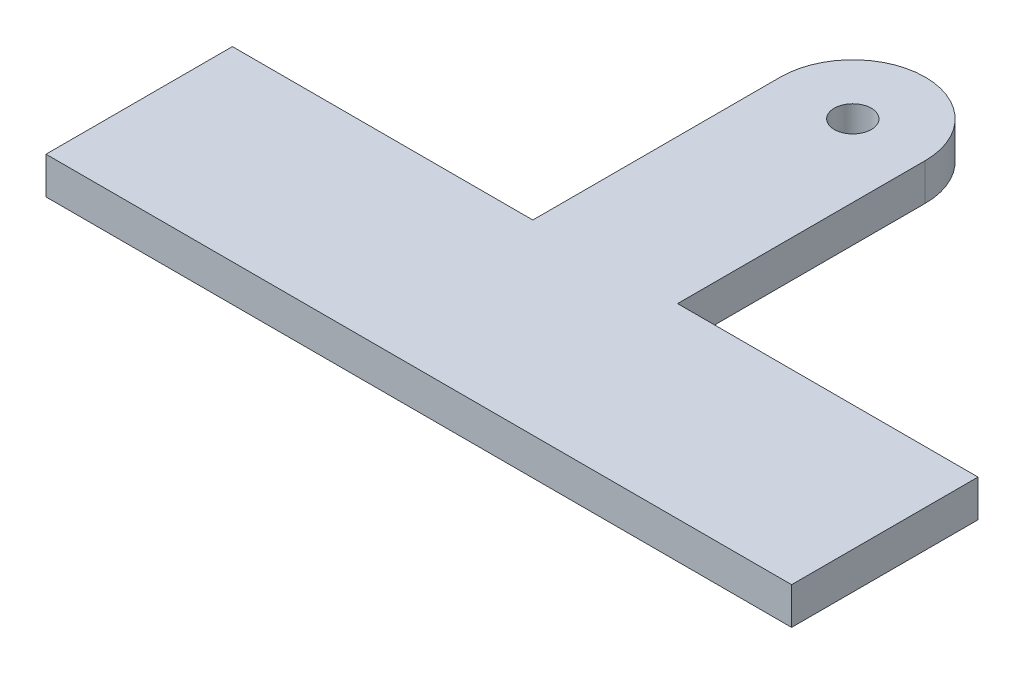
ISO-10303-21;
HEADER;
FILE_DESCRIPTION(('STEP AP214'),'2;1');
FILE_NAME('part.step','',(''),(''),'','','');
FILE_SCHEMA(('AUTOMOTIVE_DESIGN { 1 0 10303 214 1 1 1 1 }'));
ENDSEC;
DATA;
#1=APPLICATION_CONTEXT('core data for automotive mechanical design processes');
#2=APPLICATION_PROTOCOL_DEFINITION('international standard','automotive_design',2000,#1);
#3=PRODUCT_CONTEXT('',#1,'mechanical');
#4=PRODUCT('Part','Part','',(#3));
#5=PRODUCT_RELATED_PRODUCT_CATEGORY('part','',(#4));
#6=PRODUCT_DEFINITION_FORMATION('','',#4);
#7=PRODUCT_DEFINITION_CONTEXT('part definition',#1,'design');
#8=PRODUCT_DEFINITION('design','',#6,#7);
#9=PRODUCT_DEFINITION_SHAPE('','',#8);
#10=(LENGTH_UNIT() NAMED_UNIT(*) SI_UNIT(.MILLI.,.METRE.));
#11=(NAMED_UNIT(*) PLANE_ANGLE_UNIT() SI_UNIT($,.RADIAN.));
#12=(NAMED_UNIT(*) SI_UNIT($,.STERADIAN.) SOLID_ANGLE_UNIT());
#13=UNCERTAINTY_MEASURE_WITH_UNIT(LENGTH_MEASURE(1.E-05),#10,'distance_accuracy_value','');
#14=(GEOMETRIC_REPRESENTATION_CONTEXT(3) GLOBAL_UNCERTAINTY_ASSIGNED_CONTEXT((#13)) GLOBAL_UNIT_ASSIGNED_CONTEXT((#10,
#11,#12)) REPRESENTATION_CONTEXT('',''));
#15=CARTESIAN_POINT('',(0.,0.,0.));
#16=DIRECTION('',(0.,0.,1.));
#17=DIRECTION('',(1.,0.,0.));
#18=AXIS2_PLACEMENT_3D('',#15,#16,#17);
#19=CARTESIAN_POINT('',(0.,1.27,-16.9801410791967));
#20=DIRECTION('',(0.,-1.,0.));
#21=DIRECTION('',(0.,0.,-1.));
#22=AXIS2_PLACEMENT_3D('',#19,#20,#21);
#23=PLANE('',#22);
#24=DIRECTION('',(0.,0.,1.));
#25=VECTOR('',#24,1.);
#26=CARTESIAN_POINT('',(-25.5650668728774,1.27,0.));
#27=LINE('',#26,#25);
#28=CARTESIAN_POINT('',(-25.5650668728774,1.27,0.));
#29=VERTEX_POINT('',#28);
#30=CARTESIAN_POINT('',(-25.5650668728774,1.27,12.7825334364387));
#31=VERTEX_POINT('',#30);
#32=EDGE_CURVE('E145',#29,#31,#27,.T.);
#33=ORIENTED_EDGE('',*,*,#32,.T.);
#34=DIRECTION('',(1.,0.,0.));
#35=VECTOR('',#34,1.);
#36=CARTESIAN_POINT('',(-25.5650668728774,1.27,12.7825334364387));
#37=LINE('',#36,#35);
#38=CARTESIAN_POINT('',(25.5650668728774,1.27,12.7825334364387));
#39=VERTEX_POINT('',#38);
#40=EDGE_CURVE('E93',#31,#39,#37,.T.);
#41=ORIENTED_EDGE('',*,*,#40,.T.);
#42=DIRECTION('',(0.,0.,-1.));
#43=VECTOR('',#42,1.);
#44=CARTESIAN_POINT('',(25.5650668728774,1.27,0.));
#45=LINE('',#44,#43);
#46=CARTESIAN_POINT('',(25.5650668728774,1.27,0.));
#47=VERTEX_POINT('',#46);
#48=EDGE_CURVE('E160',#39,#47,#45,.T.);
#49=ORIENTED_EDGE('',*,*,#48,.T.);
#50=DIRECTION('',(-1.,0.,0.));
#51=VECTOR('',#50,1.);
#52=CARTESIAN_POINT('',(4.96381371332689,1.27,0.));
#53=LINE('',#52,#51);
#54=CARTESIAN_POINT('',(4.96381371332689,1.27,0.));
#55=VERTEX_POINT('',#54);
#56=EDGE_CURVE('E173',#47,#55,#53,.T.);
#57=ORIENTED_EDGE('',*,*,#56,.T.);
#58=DIRECTION('',(0.,0.,-1.));
#59=VECTOR('',#58,1.);
#60=CARTESIAN_POINT('',(4.96381371332689,1.27,0.));
#61=LINE('',#60,#59);
#62=CARTESIAN_POINT('',(4.96381371332689,1.27,-16.9801410791967));
#63=VERTEX_POINT('',#62);
#64=EDGE_CURVE('E112',#55,#63,#61,.T.);
#65=ORIENTED_EDGE('',*,*,#64,.T.);
#66=CARTESIAN_POINT('',(0.,1.27,-16.9801410791967));
#67=DIRECTION('',(0.,1.,0.));
#68=DIRECTION('',(0.,0.,-1.));
#69=AXIS2_PLACEMENT_3D('',#66,#67,#68);
#70=CIRCLE('',#69,4.96381371332689);
#71=CARTESIAN_POINT('',(-4.96381371332689,1.27,-16.9801410791967));
#72=VERTEX_POINT('',#71);
#73=EDGE_CURVE('E106',#63,#72,#70,.T.);
#74=ORIENTED_EDGE('',*,*,#73,.T.);
#75=DIRECTION('',(0.,0.,1.));
#76=VECTOR('',#75,1.);
#77=CARTESIAN_POINT('',(-4.96381371332689,1.27,0.));
#78=LINE('',#77,#76);
#79=CARTESIAN_POINT('',(-4.96381371332689,1.27,0.));
#80=VERTEX_POINT('',#79);
#81=EDGE_CURVE('E110',#72,#80,#78,.T.);
#82=ORIENTED_EDGE('',*,*,#81,.T.);
#83=DIRECTION('',(-1.,0.,0.));
#84=VECTOR('',#83,1.);
#85=CARTESIAN_POINT('',(-25.5650668728774,1.27,0.));
#86=LINE('',#85,#84);
#87=EDGE_CURVE('E50',#80,#29,#86,.T.);
#88=ORIENTED_EDGE('',*,*,#87,.T.);
#89=EDGE_LOOP('',(#33,#41,#49,#57,#65,#74,#82,#88));
#90=FACE_BOUND('',#89,.T.);
#91=CARTESIAN_POINT('',(0.,1.27,-16.9801410791967));
#92=DIRECTION('',(0.,1.,0.));
#93=DIRECTION('',(0.,0.,1.));
#94=AXIS2_PLACEMENT_3D('',#91,#92,#93);
#95=CIRCLE('',#94,1.27);
#96=CARTESIAN_POINT('',(0.,1.27,-15.7101410791967));
#97=VERTEX_POINT('',#96);
#98=EDGE_CURVE('E134',#97,#97,#95,.T.);
#99=ORIENTED_EDGE('',*,*,#98,.F.);
#100=EDGE_LOOP('',(#99));
#101=FACE_BOUND('',#100,.T.);
#102=ADVANCED_FACE('F33',(#90,#101),#23,.F.);
#103=CARTESIAN_POINT('',(0.,-1.27,-16.9801410791967));
#104=DIRECTION('',(0.,-1.,0.));
#105=DIRECTION('',(0.,0.,-1.));
#106=AXIS2_PLACEMENT_3D('',#103,#104,#105);
#107=PLANE('',#106);
#108=DIRECTION('',(0.,0.,1.));
#109=VECTOR('',#108,1.);
#110=CARTESIAN_POINT('',(-25.5650668728774,-1.27,0.));
#111=LINE('',#110,#109);
#112=CARTESIAN_POINT('',(-25.5650668728774,-1.27,0.));
#113=VERTEX_POINT('',#112);
#114=CARTESIAN_POINT('',(-25.5650668728774,-1.27,12.7825334364387));
#115=VERTEX_POINT('',#114);
#116=EDGE_CURVE('E130',#113,#115,#111,.T.);
#117=ORIENTED_EDGE('',*,*,#116,.F.);
#118=DIRECTION('',(-1.,0.,0.));
#119=VECTOR('',#118,1.);
#120=CARTESIAN_POINT('',(-25.5650668728774,-1.27,0.));
#121=LINE('',#120,#119);
#122=CARTESIAN_POINT('',(-4.96381371332689,-1.27,0.));
#123=VERTEX_POINT('',#122);
#124=EDGE_CURVE('E85',#123,#113,#121,.T.);
#125=ORIENTED_EDGE('',*,*,#124,.F.);
#126=DIRECTION('',(0.,0.,1.));
#127=VECTOR('',#126,1.);
#128=CARTESIAN_POINT('',(-4.96381371332689,-1.27,0.));
#129=LINE('',#128,#127);
#130=CARTESIAN_POINT('',(-4.96381371332689,-1.27,-16.9801410791967));
#131=VERTEX_POINT('',#130);
#132=EDGE_CURVE('E79',#131,#123,#129,.T.);
#133=ORIENTED_EDGE('',*,*,#132,.F.);
#134=CARTESIAN_POINT('',(0.,-1.27,-16.9801410791967));
#135=DIRECTION('',(0.,1.,0.));
#136=DIRECTION('',(0.,0.,-1.));
#137=AXIS2_PLACEMENT_3D('',#134,#135,#136);
#138=CIRCLE('',#137,4.96381371332689);
#139=CARTESIAN_POINT('',(4.96381371332689,-1.27,-16.9801410791967));
#140=VERTEX_POINT('',#139);
#141=EDGE_CURVE('E120',#140,#131,#138,.T.);
#142=ORIENTED_EDGE('',*,*,#141,.F.);
#143=DIRECTION('',(0.,0.,-1.));
#144=VECTOR('',#143,1.);
#145=CARTESIAN_POINT('',(4.96381371332689,-1.27,0.));
#146=LINE('',#145,#144);
#147=CARTESIAN_POINT('',(4.96381371332689,-1.27,0.));
#148=VERTEX_POINT('',#147);
#149=EDGE_CURVE('E140',#148,#140,#146,.T.);
#150=ORIENTED_EDGE('',*,*,#149,.F.);
#151=DIRECTION('',(-1.,0.,0.));
#152=VECTOR('',#151,1.);
#153=CARTESIAN_POINT('',(4.96381371332689,-1.27,0.));
#154=LINE('',#153,#152);
#155=CARTESIAN_POINT('',(25.5650668728774,-1.27,0.));
#156=VERTEX_POINT('',#155);
#157=EDGE_CURVE('E138',#156,#148,#154,.T.);
#158=ORIENTED_EDGE('',*,*,#157,.F.);
#159=DIRECTION('',(0.,0.,-1.));
#160=VECTOR('',#159,1.);
#161=CARTESIAN_POINT('',(25.5650668728774,-1.27,0.));
#162=LINE('',#161,#160);
#163=CARTESIAN_POINT('',(25.5650668728774,-1.27,12.7825334364387));
#164=VERTEX_POINT('',#163);
#165=EDGE_CURVE('E136',#164,#156,#162,.T.);
#166=ORIENTED_EDGE('',*,*,#165,.F.);
#167=DIRECTION('',(1.,0.,0.));
#168=VECTOR('',#167,1.);
#169=CARTESIAN_POINT('',(-25.5650668728774,-1.27,12.7825334364387));
#170=LINE('',#169,#168);
#171=EDGE_CURVE('E133',#115,#164,#170,.T.);
#172=ORIENTED_EDGE('',*,*,#171,.F.);
#173=EDGE_LOOP('',(#117,#125,#133,#142,#150,#158,#166,#172));
#174=FACE_BOUND('',#173,.T.);
#175=CARTESIAN_POINT('',(0.,-1.27,-16.9801410791967));
#176=DIRECTION('',(0.,1.,0.));
#177=DIRECTION('',(0.,0.,1.));
#178=AXIS2_PLACEMENT_3D('',#175,#176,#177);
#179=CIRCLE('',#178,1.27);
#180=CARTESIAN_POINT('',(0.,-1.27,-15.7101410791967));
#181=VERTEX_POINT('',#180);
#182=EDGE_CURVE('E179',#181,#181,#179,.T.);
#183=ORIENTED_EDGE('',*,*,#182,.T.);
#184=EDGE_LOOP('',(#183));
#185=FACE_BOUND('',#184,.T.);
#186=ADVANCED_FACE('F164',(#174,#185),#107,.T.);
#187=CARTESIAN_POINT('',(-25.5650668728774,1.27,0.));
#188=DIRECTION('',(1.,0.,0.));
#189=DIRECTION('',(0.,0.,-1.));
#190=AXIS2_PLACEMENT_3D('',#187,#188,#189);
#191=PLANE('',#190);
#192=ORIENTED_EDGE('',*,*,#116,.T.);
#193=DIRECTION('',(0.,-1.,0.));
#194=VECTOR('',#193,1.);
#195=CARTESIAN_POINT('',(-25.5650668728774,1.27,12.7825334364387));
#196=LINE('',#195,#194);
#197=EDGE_CURVE('E11',#31,#115,#196,.T.);
#198=ORIENTED_EDGE('',*,*,#197,.F.);
#199=ORIENTED_EDGE('',*,*,#32,.F.);
#200=DIRECTION('',(0.,-1.,0.));
#201=VECTOR('',#200,1.);
#202=CARTESIAN_POINT('',(-25.5650668728774,1.27,0.));
#203=LINE('',#202,#201);
#204=EDGE_CURVE('E126',#29,#113,#203,.T.);
#205=ORIENTED_EDGE('',*,*,#204,.T.);
#206=EDGE_LOOP('',(#192,#198,#199,#205));
#207=FACE_BOUND('',#206,.T.);
#208=ADVANCED_FACE('F35',(#207),#191,.F.);
#209=CARTESIAN_POINT('',(-25.5650668728774,1.27,12.7825334364387));
#210=DIRECTION('',(0.,0.,-1.));
#211=DIRECTION('',(-1.,0.,0.));
#212=AXIS2_PLACEMENT_3D('',#209,#210,#211);
#213=PLANE('',#212);
#214=ORIENTED_EDGE('',*,*,#171,.T.);
#215=DIRECTION('',(0.,-1.,0.));
#216=VECTOR('',#215,1.);
#217=CARTESIAN_POINT('',(25.5650668728774,1.27,12.7825334364387));
#218=LINE('',#217,#216);
#219=EDGE_CURVE('E42',#39,#164,#218,.T.);
#220=ORIENTED_EDGE('',*,*,#219,.F.);
#221=ORIENTED_EDGE('',*,*,#40,.F.);
#222=ORIENTED_EDGE('',*,*,#197,.T.);
#223=EDGE_LOOP('',(#214,#220,#221,#222));
#224=FACE_BOUND('',#223,.T.);
#225=ADVANCED_FACE('F207',(#224),#213,.F.);
#226=CARTESIAN_POINT('',(25.5650668728774,1.27,0.));
#227=DIRECTION('',(-1.,0.,0.));
#228=DIRECTION('',(0.,0.,1.));
#229=AXIS2_PLACEMENT_3D('',#226,#227,#228);
#230=PLANE('',#229);
#231=ORIENTED_EDGE('',*,*,#165,.T.);
#232=DIRECTION('',(0.,-1.,0.));
#233=VECTOR('',#232,1.);
#234=CARTESIAN_POINT('',(25.5650668728774,1.27,0.));
#235=LINE('',#234,#233);
#236=EDGE_CURVE('E152',#47,#156,#235,.T.);
#237=ORIENTED_EDGE('',*,*,#236,.F.);
#238=ORIENTED_EDGE('',*,*,#48,.F.);
#239=ORIENTED_EDGE('',*,*,#219,.T.);
#240=EDGE_LOOP('',(#231,#237,#238,#239));
#241=FACE_BOUND('',#240,.T.);
#242=ADVANCED_FACE('F158',(#241),#230,.F.);
#243=CARTESIAN_POINT('',(4.96381371332689,1.27,0.));
#244=DIRECTION('',(0.,0.,1.));
#245=DIRECTION('',(1.,0.,0.));
#246=AXIS2_PLACEMENT_3D('',#243,#244,#245);
#247=PLANE('',#246);
#248=ORIENTED_EDGE('',*,*,#157,.T.);
#249=DIRECTION('',(0.,-1.,0.));
#250=VECTOR('',#249,1.);
#251=CARTESIAN_POINT('',(4.96381371332689,1.27,0.));
#252=LINE('',#251,#250);
#253=EDGE_CURVE('E149',#55,#148,#252,.T.);
#254=ORIENTED_EDGE('',*,*,#253,.F.);
#255=ORIENTED_EDGE('',*,*,#56,.F.);
#256=ORIENTED_EDGE('',*,*,#236,.T.);
#257=EDGE_LOOP('',(#248,#254,#255,#256));
#258=FACE_BOUND('',#257,.T.);
#259=ADVANCED_FACE('F169',(#258),#247,.F.);
#260=CARTESIAN_POINT('',(4.96381371332689,1.27,0.));
#261=DIRECTION('',(-1.,0.,0.));
#262=DIRECTION('',(0.,0.,1.));
#263=AXIS2_PLACEMENT_3D('',#260,#261,#262);
#264=PLANE('',#263);
#265=ORIENTED_EDGE('',*,*,#149,.T.);
#266=DIRECTION('',(0.,-1.,0.));
#267=VECTOR('',#266,1.);
#268=CARTESIAN_POINT('',(4.96381371332689,1.27,-16.9801410791967));
#269=LINE('',#268,#267);
#270=EDGE_CURVE('E121',#63,#140,#269,.T.);
#271=ORIENTED_EDGE('',*,*,#270,.F.);
#272=ORIENTED_EDGE('',*,*,#64,.F.);
#273=ORIENTED_EDGE('',*,*,#253,.T.);
#274=EDGE_LOOP('',(#265,#271,#272,#273));
#275=FACE_BOUND('',#274,.T.);
#276=ADVANCED_FACE('F172',(#275),#264,.F.);
#277=CARTESIAN_POINT('',(0.,1.27,-16.9801410791967));
#278=DIRECTION('',(0.,-1.,0.));
#279=DIRECTION('',(0.,0.,-1.));
#280=AXIS2_PLACEMENT_3D('',#277,#278,#279);
#281=CYLINDRICAL_SURFACE('',#280,4.96381371332689);
#282=ORIENTED_EDGE('',*,*,#141,.T.);
#283=DIRECTION('',(0.,-1.,0.));
#284=VECTOR('',#283,1.);
#285=CARTESIAN_POINT('',(-4.96381371332689,1.27,-16.9801410791967));
#286=LINE('',#285,#284);
#287=EDGE_CURVE('E117',#72,#131,#286,.T.);
#288=ORIENTED_EDGE('',*,*,#287,.F.);
#289=ORIENTED_EDGE('',*,*,#73,.F.);
#290=ORIENTED_EDGE('',*,*,#270,.T.);
#291=EDGE_LOOP('',(#282,#288,#289,#290));
#292=FACE_BOUND('',#291,.T.);
#293=ADVANCED_FACE('F118',(#292),#281,.T.);
#294=CARTESIAN_POINT('',(-4.96381371332689,1.27,0.));
#295=DIRECTION('',(1.,0.,0.));
#296=DIRECTION('',(0.,0.,-1.));
#297=AXIS2_PLACEMENT_3D('',#294,#295,#296);
#298=PLANE('',#297);
#299=ORIENTED_EDGE('',*,*,#132,.T.);
#300=DIRECTION('',(0.,-1.,0.));
#301=VECTOR('',#300,1.);
#302=CARTESIAN_POINT('',(-4.96381371332689,1.27,0.));
#303=LINE('',#302,#301);
#304=EDGE_CURVE('E122',#80,#123,#303,.T.);
#305=ORIENTED_EDGE('',*,*,#304,.F.);
#306=ORIENTED_EDGE('',*,*,#81,.F.);
#307=ORIENTED_EDGE('',*,*,#287,.T.);
#308=EDGE_LOOP('',(#299,#305,#306,#307));
#309=FACE_BOUND('',#308,.T.);
#310=ADVANCED_FACE('F124',(#309),#298,.F.);
#311=CARTESIAN_POINT('',(-25.5650668728774,1.27,0.));
#312=DIRECTION('',(0.,0.,1.));
#313=DIRECTION('',(1.,0.,0.));
#314=AXIS2_PLACEMENT_3D('',#311,#312,#313);
#315=PLANE('',#314);
#316=ORIENTED_EDGE('',*,*,#124,.T.);
#317=ORIENTED_EDGE('',*,*,#204,.F.);
#318=ORIENTED_EDGE('',*,*,#87,.F.);
#319=ORIENTED_EDGE('',*,*,#304,.T.);
#320=EDGE_LOOP('',(#316,#317,#318,#319));
#321=FACE_BOUND('',#320,.T.);
#322=ADVANCED_FACE('F195',(#321),#315,.F.);
#323=CARTESIAN_POINT('',(0.,1.27,-16.9801410791967));
#324=DIRECTION('',(0.,-1.,0.));
#325=DIRECTION('',(0.,0.,-1.));
#326=AXIS2_PLACEMENT_3D('',#323,#324,#325);
#327=CYLINDRICAL_SURFACE('',#326,1.27);
#328=ORIENTED_EDGE('',*,*,#98,.T.);
#329=EDGE_LOOP('',(#328));
#330=FACE_BOUND('',#329,.T.);
#331=ORIENTED_EDGE('',*,*,#182,.F.);
#332=EDGE_LOOP('',(#331));
#333=FACE_BOUND('',#332,.T.);
#334=ADVANCED_FACE('F185',(#330,#333),#327,.F.);
#335=CLOSED_SHELL('',(#102,#186,#208,#225,#242,#259,#276,#293,#310,#322,#334));
#336=MANIFOLD_SOLID_BREP('B2',#335);
#337=ADVANCED_BREP_SHAPE_REPRESENTATION('',(#18,#336),#14);
#338=SHAPE_DEFINITION_REPRESENTATION(#9,#337);
ENDSEC;
END-ISO-10303-21;
